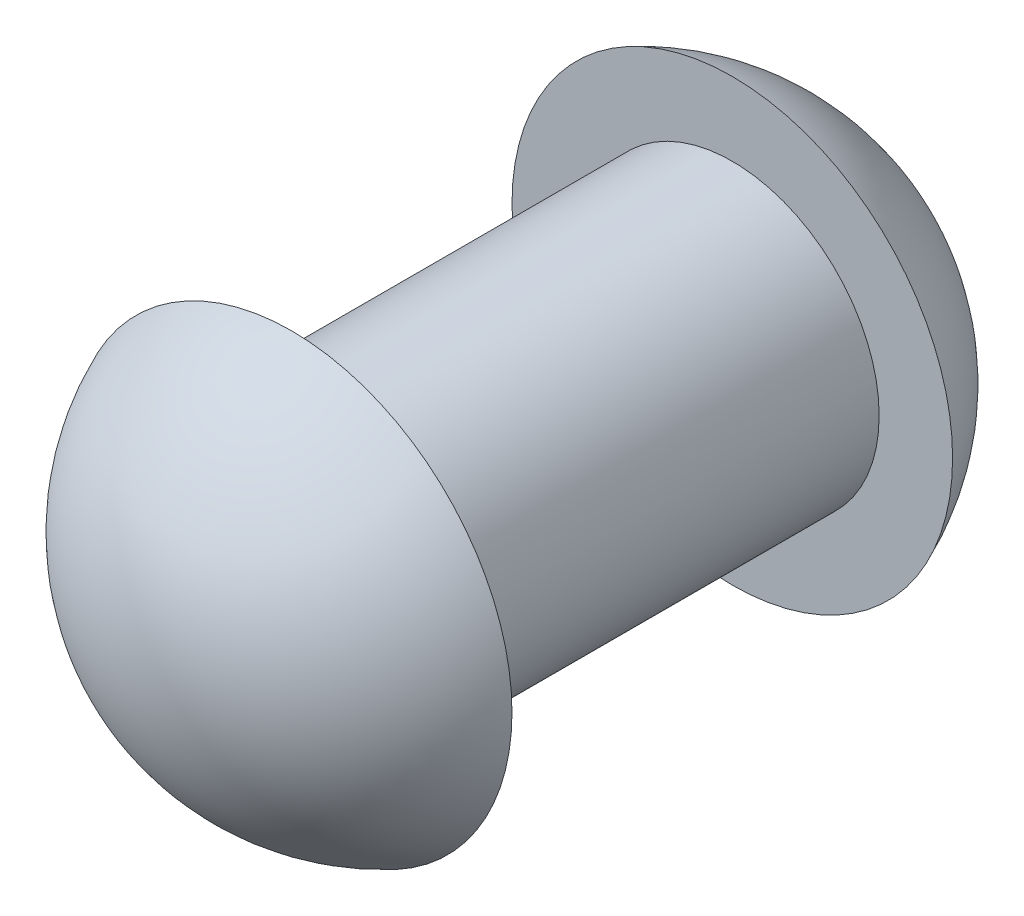
ISO-10303-21;
HEADER;
FILE_DESCRIPTION(('STEP AP214'),'2;1');
FILE_NAME('part.step','',(''),(''),'','','');
FILE_SCHEMA(('AUTOMOTIVE_DESIGN { 1 0 10303 214 1 1 1 1 }'));
ENDSEC;
DATA;
#1=APPLICATION_CONTEXT('core data for automotive mechanical design processes');
#2=APPLICATION_PROTOCOL_DEFINITION('international standard','automotive_design',2000,#1);
#3=PRODUCT_CONTEXT('',#1,'mechanical');
#4=PRODUCT('Part','Part','',(#3));
#5=PRODUCT_RELATED_PRODUCT_CATEGORY('part','',(#4));
#6=PRODUCT_DEFINITION_FORMATION('','',#4);
#7=PRODUCT_DEFINITION_CONTEXT('part definition',#1,'design');
#8=PRODUCT_DEFINITION('design','',#6,#7);
#9=PRODUCT_DEFINITION_SHAPE('','',#8);
#10=(LENGTH_UNIT() NAMED_UNIT(*) SI_UNIT(.MILLI.,.METRE.));
#11=(NAMED_UNIT(*) PLANE_ANGLE_UNIT() SI_UNIT($,.RADIAN.));
#12=(NAMED_UNIT(*) SI_UNIT($,.STERADIAN.) SOLID_ANGLE_UNIT());
#13=UNCERTAINTY_MEASURE_WITH_UNIT(LENGTH_MEASURE(1.E-05),#10,'distance_accuracy_value','');
#14=(GEOMETRIC_REPRESENTATION_CONTEXT(3) GLOBAL_UNCERTAINTY_ASSIGNED_CONTEXT((#13)) GLOBAL_UNIT_ASSIGNED_CONTEXT((#10,
#11,#12)) REPRESENTATION_CONTEXT('',''));
#15=CARTESIAN_POINT('',(0.,0.,0.));
#16=DIRECTION('',(0.,0.,1.));
#17=DIRECTION('',(1.,0.,0.));
#18=AXIS2_PLACEMENT_3D('',#15,#16,#17);
#19=CARTESIAN_POINT('',(0.,0.,-0.875));
#20=DIRECTION('',(0.,0.,-1.));
#21=DIRECTION('',(1.,0.,0.));
#22=AXIS2_PLACEMENT_3D('',#19,#20,#21);
#23=SPHERICAL_SURFACE('',#22,1.625);
#24=CARTESIAN_POINT('',(0.,0.,-1.5));
#25=DIRECTION('',(0.,0.,-1.));
#26=DIRECTION('',(-1.,0.,0.));
#27=AXIS2_PLACEMENT_3D('',#24,#25,#26);
#28=CIRCLE('',#27,1.5);
#29=CARTESIAN_POINT('',(-1.5,0.,-1.5));
#30=VERTEX_POINT('',#29);
#31=EDGE_CURVE('E10',#30,#30,#28,.T.);
#32=ORIENTED_EDGE('',*,*,#31,.T.);
#33=EDGE_LOOP('',(#32));
#34=FACE_BOUND('',#33,.T.);
#35=ADVANCED_FACE('F32',(#34),#23,.T.);
#36=CARTESIAN_POINT('',(1.5,0.,-1.5));
#37=DIRECTION('',(0.,0.,-1.));
#38=DIRECTION('',(-1.,0.,0.));
#39=AXIS2_PLACEMENT_3D('',#36,#37,#38);
#40=PLANE('',#39);
#41=ORIENTED_EDGE('',*,*,#31,.F.);
#42=EDGE_LOOP('',(#41));
#43=FACE_BOUND('',#42,.T.);
#44=CARTESIAN_POINT('',(0.,0.,-1.5));
#45=DIRECTION('',(0.,0.,-1.));
#46=DIRECTION('',(-1.,0.,0.));
#47=AXIS2_PLACEMENT_3D('',#44,#45,#46);
#48=CIRCLE('',#47,1.);
#49=CARTESIAN_POINT('',(-1.,0.,-1.5));
#50=VERTEX_POINT('',#49);
#51=EDGE_CURVE('E38',#50,#50,#48,.T.);
#52=ORIENTED_EDGE('',*,*,#51,.T.);
#53=EDGE_LOOP('',(#52));
#54=FACE_BOUND('',#53,.T.);
#55=ADVANCED_FACE('F64',(#43,#54),#40,.F.);
#56=CARTESIAN_POINT('',(0.,0.,-2.5));
#57=DIRECTION('',(0.,0.,-1.));
#58=DIRECTION('',(-1.,0.,0.));
#59=AXIS2_PLACEMENT_3D('',#56,#57,#58);
#60=CYLINDRICAL_SURFACE('',#59,1.);
#61=ORIENTED_EDGE('',*,*,#51,.F.);
#62=EDGE_LOOP('',(#61));
#63=FACE_BOUND('',#62,.T.);
#64=CARTESIAN_POINT('',(0.,0.,1.5));
#65=DIRECTION('',(0.,0.,-1.));
#66=DIRECTION('',(-1.,0.,0.));
#67=AXIS2_PLACEMENT_3D('',#64,#65,#66);
#68=CIRCLE('',#67,1.);
#69=CARTESIAN_POINT('',(-0.999999999999999,0.,1.5));
#70=VERTEX_POINT('',#69);
#71=EDGE_CURVE('E42',#70,#70,#68,.T.);
#72=ORIENTED_EDGE('',*,*,#71,.T.);
#73=EDGE_LOOP('',(#72));
#74=FACE_BOUND('',#73,.T.);
#75=ADVANCED_FACE('F60',(#63,#74),#60,.T.);
#76=CARTESIAN_POINT('',(1.,0.,1.5));
#77=DIRECTION('',(0.,0.,1.));
#78=DIRECTION('',(1.,0.,0.));
#79=AXIS2_PLACEMENT_3D('',#76,#77,#78);
#80=PLANE('',#79);
#81=ORIENTED_EDGE('',*,*,#71,.F.);
#82=EDGE_LOOP('',(#81));
#83=FACE_BOUND('',#82,.T.);
#84=CARTESIAN_POINT('',(0.,0.,1.5));
#85=DIRECTION('',(0.,0.,-1.));
#86=DIRECTION('',(-1.,0.,0.));
#87=AXIS2_PLACEMENT_3D('',#84,#85,#86);
#88=CIRCLE('',#87,1.5);
#89=CARTESIAN_POINT('',(-1.5,0.,1.5));
#90=VERTEX_POINT('',#89);
#91=EDGE_CURVE('E46',#90,#90,#88,.T.);
#92=ORIENTED_EDGE('',*,*,#91,.T.);
#93=EDGE_LOOP('',(#92));
#94=FACE_BOUND('',#93,.T.);
#95=ADVANCED_FACE('F52',(#83,#94),#80,.F.);
#96=CARTESIAN_POINT('',(0.,0.,0.874999999999999));
#97=DIRECTION('',(0.,0.,-1.));
#98=DIRECTION('',(-1.,0.,0.));
#99=AXIS2_PLACEMENT_3D('',#96,#97,#98);
#100=SPHERICAL_SURFACE('',#99,1.625);
#101=ORIENTED_EDGE('',*,*,#91,.F.);
#102=EDGE_LOOP('',(#101));
#103=FACE_BOUND('',#102,.T.);
#104=ADVANCED_FACE('F54',(#103),#100,.T.);
#105=CLOSED_SHELL('',(#35,#55,#75,#95,#104));
#106=MANIFOLD_SOLID_BREP('B2',#105);
#107=ADVANCED_BREP_SHAPE_REPRESENTATION('',(#18,#106),#14);
#108=SHAPE_DEFINITION_REPRESENTATION(#9,#107);
ENDSEC;
END-ISO-10303-21;
